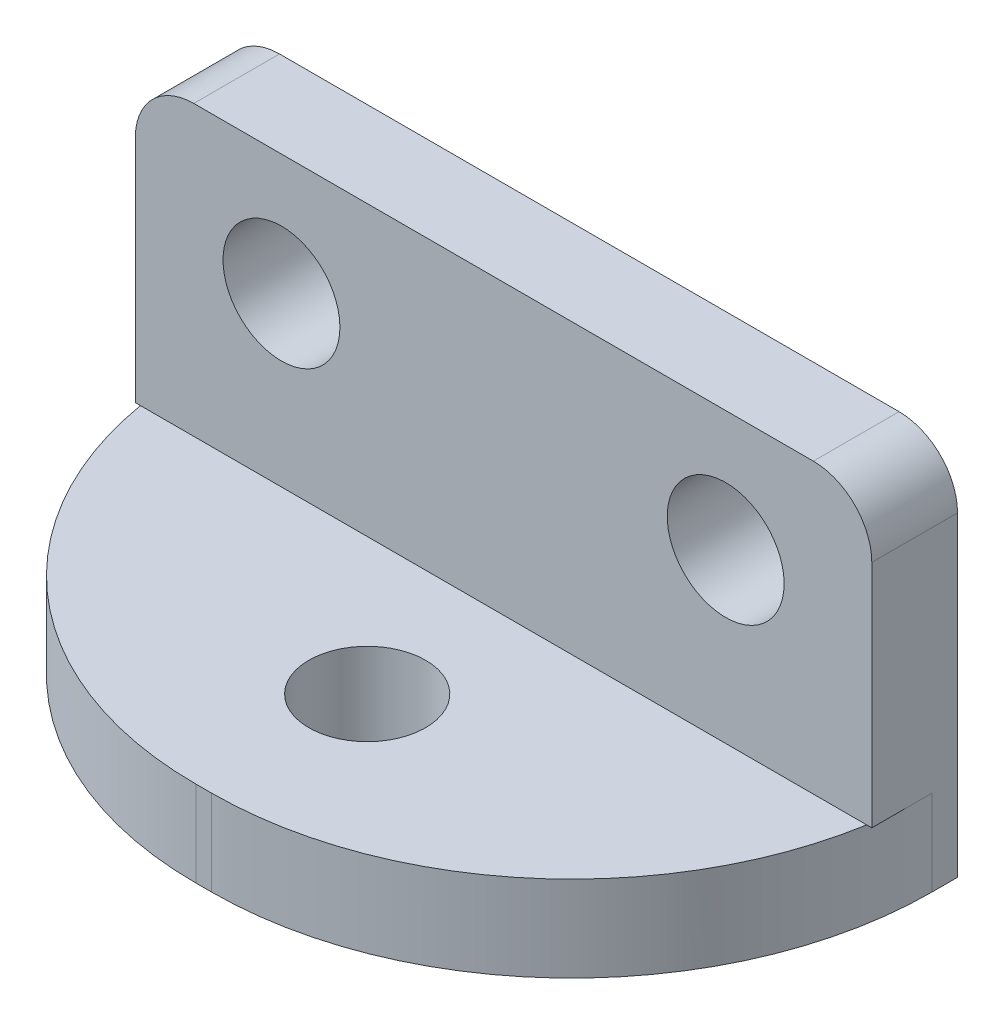
ISO-10303-21;
HEADER;
FILE_DESCRIPTION(('STEP AP214'),'2;1');
FILE_NAME('part.step','',(''),(''),'','','');
FILE_SCHEMA(('AUTOMOTIVE_DESIGN { 1 0 10303 214 1 1 1 1 }'));
ENDSEC;
DATA;
#1=APPLICATION_CONTEXT('core data for automotive mechanical design processes');
#2=APPLICATION_PROTOCOL_DEFINITION('international standard','automotive_design',2000,#1);
#3=PRODUCT_CONTEXT('',#1,'mechanical');
#4=PRODUCT('Part','Part','',(#3));
#5=PRODUCT_RELATED_PRODUCT_CATEGORY('part','',(#4));
#6=PRODUCT_DEFINITION_FORMATION('','',#4);
#7=PRODUCT_DEFINITION_CONTEXT('part definition',#1,'design');
#8=PRODUCT_DEFINITION('design','',#6,#7);
#9=PRODUCT_DEFINITION_SHAPE('','',#8);
#10=(LENGTH_UNIT() NAMED_UNIT(*) SI_UNIT(.MILLI.,.METRE.));
#11=(NAMED_UNIT(*) PLANE_ANGLE_UNIT() SI_UNIT($,.RADIAN.));
#12=(NAMED_UNIT(*) SI_UNIT($,.STERADIAN.) SOLID_ANGLE_UNIT());
#13=UNCERTAINTY_MEASURE_WITH_UNIT(LENGTH_MEASURE(1.E-05),#10,'distance_accuracy_value','');
#14=(GEOMETRIC_REPRESENTATION_CONTEXT(3) GLOBAL_UNCERTAINTY_ASSIGNED_CONTEXT((#13)) GLOBAL_UNIT_ASSIGNED_CONTEXT((#10,
#11,#12)) REPRESENTATION_CONTEXT('',''));
#15=CARTESIAN_POINT('',(0.,0.,0.));
#16=DIRECTION('',(0.,0.,1.));
#17=DIRECTION('',(1.,0.,0.));
#18=AXIS2_PLACEMENT_3D('',#15,#16,#17);
#19=CARTESIAN_POINT('',(0.,0.,2.2));
#20=DIRECTION('',(1.,0.,0.));
#21=DIRECTION('',(0.,0.,-1.));
#22=AXIS2_PLACEMENT_3D('',#19,#20,#21);
#23=PLANE('',#22);
#24=DIRECTION('',(0.,-1.,0.));
#25=VECTOR('',#24,1.);
#26=CARTESIAN_POINT('',(0.,2.2,0.649999999999937));
#27=LINE('',#26,#25);
#28=CARTESIAN_POINT('',(0.,2.2,0.649999999999937));
#29=VERTEX_POINT('',#28);
#30=CARTESIAN_POINT('',(0.,0.,0.649999999999937));
#31=VERTEX_POINT('',#30);
#32=EDGE_CURVE('E222',#29,#31,#27,.T.);
#33=ORIENTED_EDGE('',*,*,#32,.F.);
#34=DIRECTION('',(0.,0.,-1.));
#35=VECTOR('',#34,1.);
#36=CARTESIAN_POINT('',(0.,2.2,0.));
#37=LINE('',#36,#35);
#38=CARTESIAN_POINT('',(0.,2.2,2.2));
#39=VERTEX_POINT('',#38);
#40=EDGE_CURVE('E225',#39,#29,#37,.T.);
#41=ORIENTED_EDGE('',*,*,#40,.F.);
#42=DIRECTION('',(0.,-1.,0.));
#43=VECTOR('',#42,1.);
#44=CARTESIAN_POINT('',(0.,0.,2.2));
#45=LINE('',#44,#43);
#46=CARTESIAN_POINT('',(0.,8.09999999999999,2.2));
#47=VERTEX_POINT('',#46);
#48=EDGE_CURVE('E180',#47,#39,#45,.T.);
#49=ORIENTED_EDGE('',*,*,#48,.F.);
#50=DIRECTION('',(0.,0.,-1.));
#51=VECTOR('',#50,1.);
#52=CARTESIAN_POINT('',(0.,8.09999999999999,2.2));
#53=LINE('',#52,#51);
#54=CARTESIAN_POINT('',(0.,8.09999999999999,0.));
#55=VERTEX_POINT('',#54);
#56=EDGE_CURVE('E174',#47,#55,#53,.T.);
#57=ORIENTED_EDGE('',*,*,#56,.T.);
#58=DIRECTION('',(0.,-1.,0.));
#59=VECTOR('',#58,1.);
#60=CARTESIAN_POINT('',(0.,0.,0.));
#61=LINE('',#60,#59);
#62=CARTESIAN_POINT('',(0.,0.,0.));
#63=VERTEX_POINT('',#62);
#64=EDGE_CURVE('E188',#55,#63,#61,.T.);
#65=ORIENTED_EDGE('',*,*,#64,.T.);
#66=DIRECTION('',(0.,0.,-1.));
#67=VECTOR('',#66,1.);
#68=CARTESIAN_POINT('',(0.,0.,2.2));
#69=LINE('',#68,#67);
#70=EDGE_CURVE('E12',#31,#63,#69,.T.);
#71=ORIENTED_EDGE('',*,*,#70,.F.);
#72=EDGE_LOOP('',(#33,#41,#49,#57,#65,#71));
#73=FACE_BOUND('',#72,.T.);
#74=ADVANCED_FACE('F61',(#73),#23,.F.);
#75=CARTESIAN_POINT('',(0.,0.,2.2));
#76=DIRECTION('',(0.,1.,0.));
#77=DIRECTION('',(0.,0.,1.));
#78=AXIS2_PLACEMENT_3D('',#75,#76,#77);
#79=PLANE('',#78);
#80=CARTESIAN_POINT('',(9.45,0.,5.7));
#81=DIRECTION('',(0.,-1.,0.));
#82=DIRECTION('',(0.,0.,-1.));
#83=AXIS2_PLACEMENT_3D('',#80,#81,#82);
#84=CIRCLE('',#83,1.5);
#85=CARTESIAN_POINT('',(9.45,0.,4.2));
#86=VERTEX_POINT('',#85);
#87=EDGE_CURVE('E158',#86,#86,#84,.T.);
#88=ORIENTED_EDGE('',*,*,#87,.F.);
#89=EDGE_LOOP('',(#88));
#90=FACE_BOUND('',#89,.T.);
#91=DIRECTION('',(0.,0.,-1.));
#92=VECTOR('',#91,1.);
#93=CARTESIAN_POINT('',(18.9,0.,2.2));
#94=LINE('',#93,#92);
#95=CARTESIAN_POINT('',(18.9,0.,0.649999999999937));
#96=VERTEX_POINT('',#95);
#97=CARTESIAN_POINT('',(18.9,0.,0.));
#98=VERTEX_POINT('',#97);
#99=EDGE_CURVE('E68',#96,#98,#94,.T.);
#100=ORIENTED_EDGE('',*,*,#99,.F.);
#101=CARTESIAN_POINT('',(9.65,0.,0.650000000000003));
#102=DIRECTION('',(0.,-1.,0.));
#103=DIRECTION('',(0.,0.,-1.));
#104=AXIS2_PLACEMENT_3D('',#101,#102,#103);
#105=CIRCLE('',#104,9.25);
#106=CARTESIAN_POINT('',(9.64999999999993,0.,9.9));
#107=VERTEX_POINT('',#106);
#108=EDGE_CURVE('E142',#107,#96,#105,.F.);
#109=ORIENTED_EDGE('',*,*,#108,.F.);
#110=DIRECTION('',(1.,0.,0.));
#111=VECTOR('',#110,1.);
#112=CARTESIAN_POINT('',(0.,0.,9.9));
#113=LINE('',#112,#111);
#114=CARTESIAN_POINT('',(9.25000000000006,0.,9.9));
#115=VERTEX_POINT('',#114);
#116=EDGE_CURVE('E215',#115,#107,#113,.T.);
#117=ORIENTED_EDGE('',*,*,#116,.F.);
#118=CARTESIAN_POINT('',(9.25,0.,0.650000000000003));
#119=DIRECTION('',(0.,-1.,0.));
#120=DIRECTION('',(0.,0.,-1.));
#121=AXIS2_PLACEMENT_3D('',#118,#119,#120);
#122=CIRCLE('',#121,9.25);
#123=EDGE_CURVE('E83',#115,#31,#122,.T.);
#124=ORIENTED_EDGE('',*,*,#123,.T.);
#125=ORIENTED_EDGE('',*,*,#70,.T.);
#126=DIRECTION('',(1.,0.,0.));
#127=VECTOR('',#126,1.);
#128=CARTESIAN_POINT('',(0.,0.,0.));
#129=LINE('',#128,#127);
#130=EDGE_CURVE('E162',#63,#98,#129,.T.);
#131=ORIENTED_EDGE('',*,*,#130,.T.);
#132=EDGE_LOOP('',(#100,#109,#117,#124,#125,#131));
#133=FACE_BOUND('',#132,.T.);
#134=ADVANCED_FACE('F160',(#90,#133),#79,.F.);
#135=CARTESIAN_POINT('',(18.9,0.,2.2));
#136=DIRECTION('',(-1.,0.,0.));
#137=DIRECTION('',(0.,-1.,0.));
#138=AXIS2_PLACEMENT_3D('',#135,#136,#137);
#139=PLANE('',#138);
#140=DIRECTION('',(0.,-1.,0.));
#141=VECTOR('',#140,1.);
#142=CARTESIAN_POINT('',(18.9,2.2,0.649999999999937));
#143=LINE('',#142,#141);
#144=CARTESIAN_POINT('',(18.9,2.2,0.649999999999937));
#145=VERTEX_POINT('',#144);
#146=EDGE_CURVE('E145',#145,#96,#143,.T.);
#147=ORIENTED_EDGE('',*,*,#146,.T.);
#148=ORIENTED_EDGE('',*,*,#99,.T.);
#149=DIRECTION('',(0.,1.,0.));
#150=VECTOR('',#149,1.);
#151=CARTESIAN_POINT('',(18.9,0.,0.));
#152=LINE('',#151,#150);
#153=CARTESIAN_POINT('',(18.9,8.09999999999999,0.));
#154=VERTEX_POINT('',#153);
#155=EDGE_CURVE('E185',#98,#154,#152,.T.);
#156=ORIENTED_EDGE('',*,*,#155,.T.);
#157=DIRECTION('',(0.,0.,-1.));
#158=VECTOR('',#157,1.);
#159=CARTESIAN_POINT('',(18.9,8.09999999999999,2.2));
#160=LINE('',#159,#158);
#161=CARTESIAN_POINT('',(18.9,8.09999999999999,2.2));
#162=VERTEX_POINT('',#161);
#163=EDGE_CURVE('E164',#162,#154,#160,.T.);
#164=ORIENTED_EDGE('',*,*,#163,.F.);
#165=DIRECTION('',(0.,1.,0.));
#166=VECTOR('',#165,1.);
#167=CARTESIAN_POINT('',(18.9,0.,2.2));
#168=LINE('',#167,#166);
#169=CARTESIAN_POINT('',(18.9,2.2,2.2));
#170=VERTEX_POINT('',#169);
#171=EDGE_CURVE('E197',#170,#162,#168,.T.);
#172=ORIENTED_EDGE('',*,*,#171,.F.);
#173=DIRECTION('',(0.,0.,1.));
#174=VECTOR('',#173,1.);
#175=CARTESIAN_POINT('',(18.9,2.2,0.));
#176=LINE('',#175,#174);
#177=EDGE_CURVE('E157',#145,#170,#176,.T.);
#178=ORIENTED_EDGE('',*,*,#177,.F.);
#179=EDGE_LOOP('',(#147,#148,#156,#164,#172,#178));
#180=FACE_BOUND('',#179,.T.);
#181=ADVANCED_FACE('F154',(#180),#139,.F.);
#182=CARTESIAN_POINT('',(0.,2.2,9.9));
#183=DIRECTION('',(0.,-1.,0.));
#184=DIRECTION('',(0.,0.,-1.));
#185=AXIS2_PLACEMENT_3D('',#182,#183,#184);
#186=PLANE('',#185);
#187=CARTESIAN_POINT('',(9.45,2.2,5.7));
#188=DIRECTION('',(0.,-1.,0.));
#189=DIRECTION('',(0.,0.,-1.));
#190=AXIS2_PLACEMENT_3D('',#187,#188,#189);
#191=CIRCLE('',#190,1.5);
#192=CARTESIAN_POINT('',(9.45,2.2,4.2));
#193=VERTEX_POINT('',#192);
#194=EDGE_CURVE('E237',#193,#193,#191,.T.);
#195=ORIENTED_EDGE('',*,*,#194,.T.);
#196=EDGE_LOOP('',(#195));
#197=FACE_BOUND('',#196,.T.);
#198=DIRECTION('',(-1.,0.,0.));
#199=VECTOR('',#198,1.);
#200=CARTESIAN_POINT('',(0.,2.2,9.9));
#201=LINE('',#200,#199);
#202=CARTESIAN_POINT('',(9.64999999999993,2.2,9.9));
#203=VERTEX_POINT('',#202);
#204=CARTESIAN_POINT('',(9.25000000000006,2.2,9.9));
#205=VERTEX_POINT('',#204);
#206=EDGE_CURVE('E210',#203,#205,#201,.T.);
#207=ORIENTED_EDGE('',*,*,#206,.F.);
#208=CARTESIAN_POINT('',(9.65,2.2,0.650000000000003));
#209=DIRECTION('',(0.,-1.,0.));
#210=DIRECTION('',(0.,0.,-1.));
#211=AXIS2_PLACEMENT_3D('',#208,#209,#210);
#212=CIRCLE('',#211,9.25);
#213=CARTESIAN_POINT('',(18.7692104921424,2.2,2.2));
#214=VERTEX_POINT('',#213);
#215=EDGE_CURVE('E75',#203,#214,#212,.F.);
#216=ORIENTED_EDGE('',*,*,#215,.T.);
#217=DIRECTION('',(-1.,0.,0.));
#218=VECTOR('',#217,1.);
#219=CARTESIAN_POINT('',(0.,2.2,2.2));
#220=LINE('',#219,#218);
#221=CARTESIAN_POINT('',(0.130789507857601,2.2,2.2));
#222=VERTEX_POINT('',#221);
#223=EDGE_CURVE('E216',#214,#222,#220,.T.);
#224=ORIENTED_EDGE('',*,*,#223,.T.);
#225=CARTESIAN_POINT('',(9.25,2.2,0.650000000000003));
#226=DIRECTION('',(0.,-1.,0.));
#227=DIRECTION('',(0.,0.,-1.));
#228=AXIS2_PLACEMENT_3D('',#225,#226,#227);
#229=CIRCLE('',#228,9.25);
#230=EDGE_CURVE('E230',#205,#222,#229,.T.);
#231=ORIENTED_EDGE('',*,*,#230,.F.);
#232=EDGE_LOOP('',(#207,#216,#224,#231));
#233=FACE_BOUND('',#232,.T.);
#234=ADVANCED_FACE('F250',(#197,#233),#186,.F.);
#235=CARTESIAN_POINT('',(1.5,8.1,2.2));
#236=DIRECTION('',(0.,0.,-1.));
#237=DIRECTION('',(-1.,0.,0.));
#238=AXIS2_PLACEMENT_3D('',#235,#236,#237);
#239=PLANE('',#238);
#240=CARTESIAN_POINT('',(15.15,6.5,2.2));
#241=DIRECTION('',(0.,0.,1.));
#242=DIRECTION('',(1.,0.,0.));
#243=AXIS2_PLACEMENT_3D('',#240,#241,#242);
#244=CIRCLE('',#243,1.5);
#245=CARTESIAN_POINT('',(16.65,6.5,2.2));
#246=VERTEX_POINT('',#245);
#247=EDGE_CURVE('E204',#246,#246,#244,.T.);
#248=ORIENTED_EDGE('',*,*,#247,.F.);
#249=EDGE_LOOP('',(#248));
#250=FACE_BOUND('',#249,.T.);
#251=CARTESIAN_POINT('',(3.75,6.5,2.2));
#252=DIRECTION('',(0.,0.,1.));
#253=DIRECTION('',(1.,0.,0.));
#254=AXIS2_PLACEMENT_3D('',#251,#252,#253);
#255=CIRCLE('',#254,1.5);
#256=CARTESIAN_POINT('',(5.25,6.5,2.2));
#257=VERTEX_POINT('',#256);
#258=EDGE_CURVE('E191',#257,#257,#255,.T.);
#259=ORIENTED_EDGE('',*,*,#258,.F.);
#260=EDGE_LOOP('',(#259));
#261=FACE_BOUND('',#260,.T.);
#262=EDGE_CURVE('E213',#170,#214,#220,.T.);
#263=ORIENTED_EDGE('',*,*,#262,.F.);
#264=ORIENTED_EDGE('',*,*,#171,.T.);
#265=CARTESIAN_POINT('',(17.4,8.1,2.2));
#266=DIRECTION('',(0.,0.,1.));
#267=DIRECTION('',(1.,0.,0.));
#268=AXIS2_PLACEMENT_3D('',#265,#266,#267);
#269=CIRCLE('',#268,1.5);
#270=CARTESIAN_POINT('',(17.4,9.6,2.2));
#271=VERTEX_POINT('',#270);
#272=EDGE_CURVE('E195',#162,#271,#269,.T.);
#273=ORIENTED_EDGE('',*,*,#272,.T.);
#274=DIRECTION('',(-1.,0.,0.));
#275=VECTOR('',#274,1.);
#276=CARTESIAN_POINT('',(1.50000000000001,9.6,2.2));
#277=LINE('',#276,#275);
#278=CARTESIAN_POINT('',(1.50000000000001,9.6,2.2));
#279=VERTEX_POINT('',#278);
#280=EDGE_CURVE('E193',#271,#279,#277,.T.);
#281=ORIENTED_EDGE('',*,*,#280,.T.);
#282=CARTESIAN_POINT('',(1.5,8.1,2.2));
#283=DIRECTION('',(0.,0.,1.));
#284=DIRECTION('',(-1.,0.,0.));
#285=AXIS2_PLACEMENT_3D('',#282,#283,#284);
#286=CIRCLE('',#285,1.5);
#287=EDGE_CURVE('E177',#279,#47,#286,.T.);
#288=ORIENTED_EDGE('',*,*,#287,.T.);
#289=ORIENTED_EDGE('',*,*,#48,.T.);
#290=DIRECTION('',(-1.,0.,0.));
#291=VECTOR('',#290,1.);
#292=CARTESIAN_POINT('',(1.5,2.2,2.2));
#293=LINE('',#292,#291);
#294=EDGE_CURVE('E220',#222,#39,#293,.T.);
#295=ORIENTED_EDGE('',*,*,#294,.F.);
#296=ORIENTED_EDGE('',*,*,#223,.F.);
#297=EDGE_LOOP('',(#263,#264,#273,#281,#288,#289,#295,#296));
#298=FACE_BOUND('',#297,.T.);
#299=ADVANCED_FACE('F270',(#250,#261,#298),#239,.F.);
#300=CARTESIAN_POINT('',(1.5,8.1,0.));
#301=DIRECTION('',(0.,0.,-1.));
#302=DIRECTION('',(-1.,0.,0.));
#303=AXIS2_PLACEMENT_3D('',#300,#301,#302);
#304=PLANE('',#303);
#305=CARTESIAN_POINT('',(3.75,6.5,0.));
#306=DIRECTION('',(0.,0.,1.));
#307=DIRECTION('',(1.,0.,0.));
#308=AXIS2_PLACEMENT_3D('',#305,#306,#307);
#309=CIRCLE('',#308,1.5);
#310=CARTESIAN_POINT('',(5.25,6.5,0.));
#311=VERTEX_POINT('',#310);
#312=EDGE_CURVE('E201',#311,#311,#309,.T.);
#313=ORIENTED_EDGE('',*,*,#312,.T.);
#314=EDGE_LOOP('',(#313));
#315=FACE_BOUND('',#314,.T.);
#316=ORIENTED_EDGE('',*,*,#64,.F.);
#317=CARTESIAN_POINT('',(1.5,8.1,0.));
#318=DIRECTION('',(0.,0.,1.));
#319=DIRECTION('',(-1.,0.,0.));
#320=AXIS2_PLACEMENT_3D('',#317,#318,#319);
#321=CIRCLE('',#320,1.5);
#322=CARTESIAN_POINT('',(1.50000000000001,9.6,0.));
#323=VERTEX_POINT('',#322);
#324=EDGE_CURVE('E178',#323,#55,#321,.T.);
#325=ORIENTED_EDGE('',*,*,#324,.F.);
#326=DIRECTION('',(-1.,0.,0.));
#327=VECTOR('',#326,1.);
#328=CARTESIAN_POINT('',(1.50000000000001,9.6,0.));
#329=LINE('',#328,#327);
#330=CARTESIAN_POINT('',(17.4,9.6,0.));
#331=VERTEX_POINT('',#330);
#332=EDGE_CURVE('E181',#331,#323,#329,.T.);
#333=ORIENTED_EDGE('',*,*,#332,.F.);
#334=CARTESIAN_POINT('',(17.4,8.1,0.));
#335=DIRECTION('',(0.,0.,1.));
#336=DIRECTION('',(1.,0.,0.));
#337=AXIS2_PLACEMENT_3D('',#334,#335,#336);
#338=CIRCLE('',#337,1.5);
#339=EDGE_CURVE('E183',#154,#331,#338,.T.);
#340=ORIENTED_EDGE('',*,*,#339,.F.);
#341=ORIENTED_EDGE('',*,*,#155,.F.);
#342=ORIENTED_EDGE('',*,*,#130,.F.);
#343=EDGE_LOOP('',(#316,#325,#333,#340,#341,#342));
#344=FACE_BOUND('',#343,.T.);
#345=CARTESIAN_POINT('',(15.15,6.5,0.));
#346=DIRECTION('',(0.,0.,1.));
#347=DIRECTION('',(1.,0.,0.));
#348=AXIS2_PLACEMENT_3D('',#345,#346,#347);
#349=CIRCLE('',#348,1.5);
#350=CARTESIAN_POINT('',(16.65,6.5,0.));
#351=VERTEX_POINT('',#350);
#352=EDGE_CURVE('E207',#351,#351,#349,.T.);
#353=ORIENTED_EDGE('',*,*,#352,.T.);
#354=EDGE_LOOP('',(#353));
#355=FACE_BOUND('',#354,.T.);
#356=ADVANCED_FACE('F258',(#315,#344,#355),#304,.T.);
#357=CARTESIAN_POINT('',(17.4,8.1,2.2));
#358=DIRECTION('',(0.,0.,-1.));
#359=DIRECTION('',(-1.,0.,0.));
#360=AXIS2_PLACEMENT_3D('',#357,#358,#359);
#361=CYLINDRICAL_SURFACE('',#360,1.5);
#362=ORIENTED_EDGE('',*,*,#339,.T.);
#363=DIRECTION('',(0.,0.,-1.));
#364=VECTOR('',#363,1.);
#365=CARTESIAN_POINT('',(17.4,9.6,2.2));
#366=LINE('',#365,#364);
#367=EDGE_CURVE('E166',#271,#331,#366,.T.);
#368=ORIENTED_EDGE('',*,*,#367,.F.);
#369=ORIENTED_EDGE('',*,*,#272,.F.);
#370=ORIENTED_EDGE('',*,*,#163,.T.);
#371=EDGE_LOOP('',(#362,#368,#369,#370));
#372=FACE_BOUND('',#371,.T.);
#373=ADVANCED_FACE('F254',(#372),#361,.T.);
#374=CARTESIAN_POINT('',(1.50000000000001,9.6,2.2));
#375=DIRECTION('',(0.,-1.,0.));
#376=DIRECTION('',(0.,0.,-1.));
#377=AXIS2_PLACEMENT_3D('',#374,#375,#376);
#378=PLANE('',#377);
#379=ORIENTED_EDGE('',*,*,#332,.T.);
#380=DIRECTION('',(0.,0.,-1.));
#381=VECTOR('',#380,1.);
#382=CARTESIAN_POINT('',(1.50000000000001,9.6,2.2));
#383=LINE('',#382,#381);
#384=EDGE_CURVE('E171',#279,#323,#383,.T.);
#385=ORIENTED_EDGE('',*,*,#384,.F.);
#386=ORIENTED_EDGE('',*,*,#280,.F.);
#387=ORIENTED_EDGE('',*,*,#367,.T.);
#388=EDGE_LOOP('',(#379,#385,#386,#387));
#389=FACE_BOUND('',#388,.T.);
#390=ADVANCED_FACE('F257',(#389),#378,.F.);
#391=CARTESIAN_POINT('',(1.5,8.1,2.2));
#392=DIRECTION('',(0.,0.,-1.));
#393=DIRECTION('',(-1.,0.,0.));
#394=AXIS2_PLACEMENT_3D('',#391,#392,#393);
#395=CYLINDRICAL_SURFACE('',#394,1.5);
#396=ORIENTED_EDGE('',*,*,#324,.T.);
#397=ORIENTED_EDGE('',*,*,#56,.F.);
#398=ORIENTED_EDGE('',*,*,#287,.F.);
#399=ORIENTED_EDGE('',*,*,#384,.T.);
#400=EDGE_LOOP('',(#396,#397,#398,#399));
#401=FACE_BOUND('',#400,.T.);
#402=ADVANCED_FACE('F262',(#401),#395,.T.);
#403=CARTESIAN_POINT('',(3.75,6.5,2.2));
#404=DIRECTION('',(0.,0.,-1.));
#405=DIRECTION('',(-1.,0.,0.));
#406=AXIS2_PLACEMENT_3D('',#403,#404,#405);
#407=CYLINDRICAL_SURFACE('',#406,1.5);
#408=ORIENTED_EDGE('',*,*,#258,.T.);
#409=EDGE_LOOP('',(#408));
#410=FACE_BOUND('',#409,.T.);
#411=ORIENTED_EDGE('',*,*,#312,.F.);
#412=EDGE_LOOP('',(#411));
#413=FACE_BOUND('',#412,.T.);
#414=ADVANCED_FACE('F266',(#410,#413),#407,.F.);
#415=CARTESIAN_POINT('',(15.15,6.5,2.2));
#416=DIRECTION('',(0.,0.,-1.));
#417=DIRECTION('',(-1.,0.,0.));
#418=AXIS2_PLACEMENT_3D('',#415,#416,#417);
#419=CYLINDRICAL_SURFACE('',#418,1.5);
#420=ORIENTED_EDGE('',*,*,#247,.T.);
#421=EDGE_LOOP('',(#420));
#422=FACE_BOUND('',#421,.T.);
#423=ORIENTED_EDGE('',*,*,#352,.F.);
#424=EDGE_LOOP('',(#423));
#425=FACE_BOUND('',#424,.T.);
#426=ADVANCED_FACE('F277',(#422,#425),#419,.F.);
#427=CARTESIAN_POINT('',(0.,0.,9.9));
#428=DIRECTION('',(0.,0.,-1.));
#429=DIRECTION('',(-1.,0.,0.));
#430=AXIS2_PLACEMENT_3D('',#427,#428,#429);
#431=PLANE('',#430);
#432=ORIENTED_EDGE('',*,*,#116,.T.);
#433=DIRECTION('',(0.,-1.,0.));
#434=VECTOR('',#433,1.);
#435=CARTESIAN_POINT('',(9.64999999999993,2.2,9.9));
#436=LINE('',#435,#434);
#437=EDGE_CURVE('E147',#203,#107,#436,.T.);
#438=ORIENTED_EDGE('',*,*,#437,.F.);
#439=ORIENTED_EDGE('',*,*,#206,.T.);
#440=DIRECTION('',(0.,-1.,0.));
#441=VECTOR('',#440,1.);
#442=CARTESIAN_POINT('',(9.25000000000006,2.2,9.9));
#443=LINE('',#442,#441);
#444=EDGE_CURVE('E223',#205,#115,#443,.T.);
#445=ORIENTED_EDGE('',*,*,#444,.T.);
#446=EDGE_LOOP('',(#432,#438,#439,#445));
#447=FACE_BOUND('',#446,.T.);
#448=ADVANCED_FACE('F281',(#447),#431,.F.);
#449=CARTESIAN_POINT('',(0.,2.2,0.));
#450=DIRECTION('',(0.,-1.,0.));
#451=DIRECTION('',(0.,0.,-1.));
#452=AXIS2_PLACEMENT_3D('',#449,#450,#451);
#453=PLANE('',#452);
#454=ORIENTED_EDGE('',*,*,#294,.T.);
#455=ORIENTED_EDGE('',*,*,#40,.T.);
#456=EDGE_CURVE('E228',#222,#29,#229,.T.);
#457=ORIENTED_EDGE('',*,*,#456,.F.);
#458=EDGE_LOOP('',(#454,#455,#457));
#459=FACE_BOUND('',#458,.T.);
#460=ADVANCED_FACE('F288',(#459),#453,.T.);
#461=CARTESIAN_POINT('',(9.25,2.2,0.650000000000003));
#462=DIRECTION('',(0.,-1.,0.));
#463=DIRECTION('',(0.,0.,-1.));
#464=AXIS2_PLACEMENT_3D('',#461,#462,#463);
#465=CYLINDRICAL_SURFACE('',#464,9.25);
#466=ORIENTED_EDGE('',*,*,#123,.F.);
#467=ORIENTED_EDGE('',*,*,#444,.F.);
#468=ORIENTED_EDGE('',*,*,#230,.T.);
#469=ORIENTED_EDGE('',*,*,#456,.T.);
#470=ORIENTED_EDGE('',*,*,#32,.T.);
#471=EDGE_LOOP('',(#466,#467,#468,#469,#470));
#472=FACE_BOUND('',#471,.T.);
#473=ADVANCED_FACE('F290',(#472),#465,.T.);
#474=CARTESIAN_POINT('',(0.,2.2,0.));
#475=DIRECTION('',(0.,-1.,0.));
#476=DIRECTION('',(0.,0.,-1.));
#477=AXIS2_PLACEMENT_3D('',#474,#475,#476);
#478=PLANE('',#477);
#479=ORIENTED_EDGE('',*,*,#262,.T.);
#480=EDGE_CURVE('E234',#214,#145,#212,.F.);
#481=ORIENTED_EDGE('',*,*,#480,.T.);
#482=ORIENTED_EDGE('',*,*,#177,.T.);
#483=EDGE_LOOP('',(#479,#481,#482));
#484=FACE_BOUND('',#483,.T.);
#485=ADVANCED_FACE('F293',(#484),#478,.T.);
#486=CARTESIAN_POINT('',(9.65,2.2,0.650000000000003));
#487=DIRECTION('',(0.,-1.,0.));
#488=DIRECTION('',(0.,0.,-1.));
#489=AXIS2_PLACEMENT_3D('',#486,#487,#488);
#490=CYLINDRICAL_SURFACE('',#489,9.25);
#491=ORIENTED_EDGE('',*,*,#108,.T.);
#492=ORIENTED_EDGE('',*,*,#146,.F.);
#493=ORIENTED_EDGE('',*,*,#480,.F.);
#494=ORIENTED_EDGE('',*,*,#215,.F.);
#495=ORIENTED_EDGE('',*,*,#437,.T.);
#496=EDGE_LOOP('',(#491,#492,#493,#494,#495));
#497=FACE_BOUND('',#496,.T.);
#498=ADVANCED_FACE('F144',(#497),#490,.T.);
#499=CARTESIAN_POINT('',(9.45,2.2,5.7));
#500=DIRECTION('',(0.,-1.,0.));
#501=DIRECTION('',(0.,0.,-1.));
#502=AXIS2_PLACEMENT_3D('',#499,#500,#501);
#503=CYLINDRICAL_SURFACE('',#502,1.5);
#504=ORIENTED_EDGE('',*,*,#194,.F.);
#505=EDGE_LOOP('',(#504));
#506=FACE_BOUND('',#505,.T.);
#507=ORIENTED_EDGE('',*,*,#87,.T.);
#508=EDGE_LOOP('',(#507));
#509=FACE_BOUND('',#508,.T.);
#510=ADVANCED_FACE('F243',(#506,#509),#503,.F.);
#511=CLOSED_SHELL('',(#74,#134,#181,#234,#299,#356,#373,#390,#402,#414,#426,#448,#460,#473,#485,
#498,#510));
#512=MANIFOLD_SOLID_BREP('B2',#511);
#513=ADVANCED_BREP_SHAPE_REPRESENTATION('',(#18,#512),#14);
#514=SHAPE_DEFINITION_REPRESENTATION(#9,#513);
ENDSEC;
END-ISO-10303-21;
